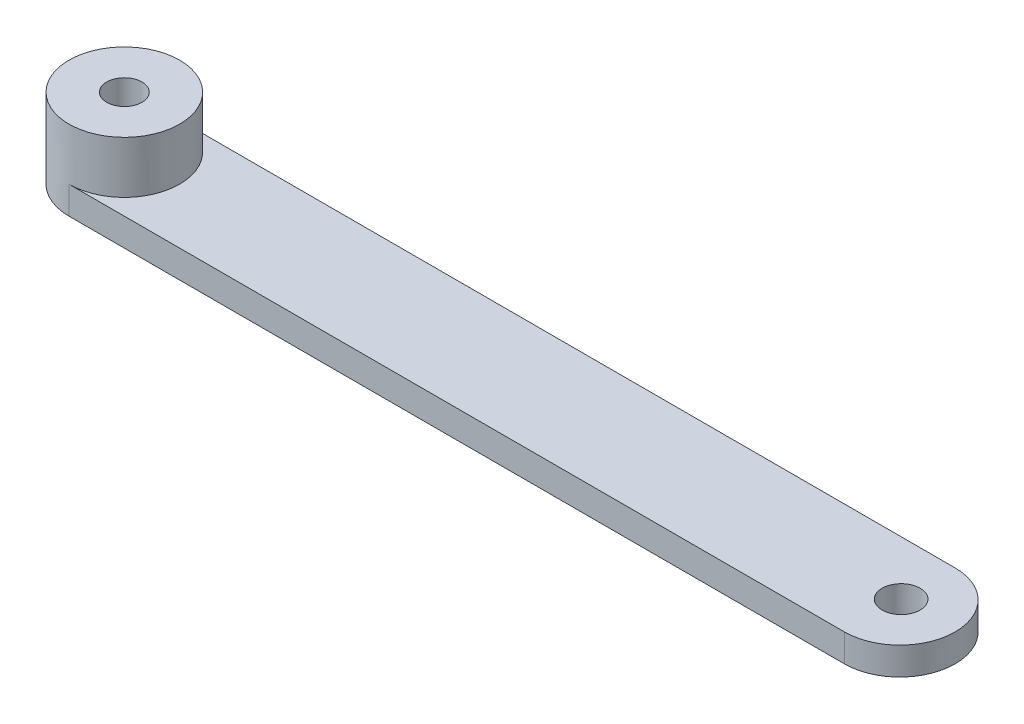
ISO-10303-21;
HEADER;
FILE_DESCRIPTION(('STEP AP214'),'2;1');
FILE_NAME('part.step','',(''),(''),'','','');
FILE_SCHEMA(('AUTOMOTIVE_DESIGN { 1 0 10303 214 1 1 1 1 }'));
ENDSEC;
DATA;
#1=APPLICATION_CONTEXT('core data for automotive mechanical design processes');
#2=APPLICATION_PROTOCOL_DEFINITION('international standard','automotive_design',2000,#1);
#3=PRODUCT_CONTEXT('',#1,'mechanical');
#4=PRODUCT('Part','Part','',(#3));
#5=PRODUCT_RELATED_PRODUCT_CATEGORY('part','',(#4));
#6=PRODUCT_DEFINITION_FORMATION('','',#4);
#7=PRODUCT_DEFINITION_CONTEXT('part definition',#1,'design');
#8=PRODUCT_DEFINITION('design','',#6,#7);
#9=PRODUCT_DEFINITION_SHAPE('','',#8);
#10=(LENGTH_UNIT() NAMED_UNIT(*) SI_UNIT(.MILLI.,.METRE.));
#11=(NAMED_UNIT(*) PLANE_ANGLE_UNIT() SI_UNIT($,.RADIAN.));
#12=(NAMED_UNIT(*) SI_UNIT($,.STERADIAN.) SOLID_ANGLE_UNIT());
#13=UNCERTAINTY_MEASURE_WITH_UNIT(LENGTH_MEASURE(1.E-05),#10,'distance_accuracy_value','');
#14=(GEOMETRIC_REPRESENTATION_CONTEXT(3) GLOBAL_UNCERTAINTY_ASSIGNED_CONTEXT((#13)) GLOBAL_UNIT_ASSIGNED_CONTEXT((#10,
#11,#12)) REPRESENTATION_CONTEXT('',''));
#15=CARTESIAN_POINT('',(0.,0.,0.));
#16=DIRECTION('',(0.,0.,1.));
#17=DIRECTION('',(1.,0.,0.));
#18=AXIS2_PLACEMENT_3D('',#15,#16,#17);
#19=CARTESIAN_POINT('',(-23.1719298245614,3.175,0.724122807017544));
#20=DIRECTION('',(0.,-1.,0.));
#21=DIRECTION('',(0.,0.,-1.));
#22=AXIS2_PLACEMENT_3D('',#19,#20,#21);
#23=CYLINDRICAL_SURFACE('',#22,6.35);
#24=CARTESIAN_POINT('',(-23.1719298245614,0.,0.724122807017544));
#25=DIRECTION('',(0.,1.,0.));
#26=DIRECTION('',(0.,0.,1.));
#27=AXIS2_PLACEMENT_3D('',#24,#25,#26);
#28=CIRCLE('',#27,6.35);
#29=CARTESIAN_POINT('',(-23.1719298245614,0.,-5.62587719298245));
#30=VERTEX_POINT('',#29);
#31=CARTESIAN_POINT('',(-23.1719298245614,0.,7.07412280701754));
#32=VERTEX_POINT('',#31);
#33=EDGE_CURVE('E101',#30,#32,#28,.T.);
#34=ORIENTED_EDGE('',*,*,#33,.T.);
#35=DIRECTION('',(0.,-1.,0.));
#36=VECTOR('',#35,1.);
#37=CARTESIAN_POINT('',(-23.1719298245614,3.175,7.07412280701754));
#38=LINE('',#37,#36);
#39=CARTESIAN_POINT('',(-23.1719298245614,3.175,7.07412280701754));
#40=VERTEX_POINT('',#39);
#41=EDGE_CURVE('E11',#40,#32,#38,.T.);
#42=ORIENTED_EDGE('',*,*,#41,.F.);
#43=CARTESIAN_POINT('',(-23.1719298245614,3.175,0.724122807017545));
#44=DIRECTION('',(0.,1.,0.));
#45=DIRECTION('',(0.,0.,1.));
#46=AXIS2_PLACEMENT_3D('',#43,#44,#45);
#47=CIRCLE('',#46,6.35);
#48=CARTESIAN_POINT('',(-23.1719298245614,3.175,-5.62587719298245));
#49=VERTEX_POINT('',#48);
#50=EDGE_CURVE('E99',#40,#49,#47,.T.);
#51=ORIENTED_EDGE('',*,*,#50,.T.);
#52=DIRECTION('',(0.,-1.,0.));
#53=VECTOR('',#52,1.);
#54=CARTESIAN_POINT('',(-23.1719298245614,3.175,-5.62587719298245));
#55=LINE('',#54,#53);
#56=EDGE_CURVE('E138',#49,#30,#55,.T.);
#57=ORIENTED_EDGE('',*,*,#56,.T.);
#58=EDGE_LOOP('',(#34,#42,#51,#57));
#59=FACE_BOUND('',#58,.T.);
#60=CARTESIAN_POINT('',(-23.1719298245614,9.1375,0.724122807017545));
#61=DIRECTION('',(0.,1.,0.));
#62=DIRECTION('',(0.,0.,-1.));
#63=AXIS2_PLACEMENT_3D('',#60,#61,#62);
#64=CIRCLE('',#63,6.35);
#65=CARTESIAN_POINT('',(-23.1719298245614,9.1375,-5.62587719298245));
#66=VERTEX_POINT('',#65);
#67=EDGE_CURVE('E112',#66,#66,#64,.T.);
#68=ORIENTED_EDGE('',*,*,#67,.F.);
#69=EDGE_LOOP('',(#68));
#70=FACE_BOUND('',#69,.T.);
#71=ADVANCED_FACE('F44',(#59,#70),#23,.T.);
#72=CARTESIAN_POINT('',(-23.1719298245614,3.175,7.07412280701754));
#73=DIRECTION('',(0.,0.,-1.));
#74=DIRECTION('',(-1.,0.,0.));
#75=AXIS2_PLACEMENT_3D('',#72,#73,#74);
#76=PLANE('',#75);
#77=DIRECTION('',(1.,0.,0.));
#78=VECTOR('',#77,1.);
#79=CARTESIAN_POINT('',(-23.1719298245614,0.,7.07412280701754));
#80=LINE('',#79,#78);
#81=CARTESIAN_POINT('',(65.7280701754386,0.,7.07412280701754));
#82=VERTEX_POINT('',#81);
#83=EDGE_CURVE('E141',#32,#82,#80,.T.);
#84=ORIENTED_EDGE('',*,*,#83,.T.);
#85=DIRECTION('',(0.,-1.,0.));
#86=VECTOR('',#85,1.);
#87=CARTESIAN_POINT('',(65.7280701754386,3.175,7.07412280701754));
#88=LINE('',#87,#86);
#89=CARTESIAN_POINT('',(65.7280701754386,3.175,7.07412280701754));
#90=VERTEX_POINT('',#89);
#91=EDGE_CURVE('E53',#90,#82,#88,.T.);
#92=ORIENTED_EDGE('',*,*,#91,.F.);
#93=DIRECTION('',(1.,0.,0.));
#94=VECTOR('',#93,1.);
#95=CARTESIAN_POINT('',(-23.1719298245614,3.175,7.07412280701754));
#96=LINE('',#95,#94);
#97=EDGE_CURVE('E91',#40,#90,#96,.T.);
#98=ORIENTED_EDGE('',*,*,#97,.F.);
#99=ORIENTED_EDGE('',*,*,#41,.T.);
#100=EDGE_LOOP('',(#84,#92,#98,#99));
#101=FACE_BOUND('',#100,.T.);
#102=ADVANCED_FACE('F103',(#101),#76,.F.);
#103=CARTESIAN_POINT('',(65.7280701754386,3.175,0.724122807017545));
#104=DIRECTION('',(0.,-1.,0.));
#105=DIRECTION('',(0.,0.,-1.));
#106=AXIS2_PLACEMENT_3D('',#103,#104,#105);
#107=CYLINDRICAL_SURFACE('',#106,6.35);
#108=CARTESIAN_POINT('',(65.7280701754386,0.,0.724122807017545));
#109=DIRECTION('',(0.,1.,0.));
#110=DIRECTION('',(0.,0.,-1.));
#111=AXIS2_PLACEMENT_3D('',#108,#109,#110);
#112=CIRCLE('',#111,6.35);
#113=CARTESIAN_POINT('',(65.7280701754386,0.,-5.62587719298245));
#114=VERTEX_POINT('',#113);
#115=EDGE_CURVE('E144',#82,#114,#112,.T.);
#116=ORIENTED_EDGE('',*,*,#115,.T.);
#117=DIRECTION('',(0.,-1.,0.));
#118=VECTOR('',#117,1.);
#119=CARTESIAN_POINT('',(65.7280701754386,3.175,-5.62587719298245));
#120=LINE('',#119,#118);
#121=CARTESIAN_POINT('',(65.7280701754386,3.175,-5.62587719298245));
#122=VERTEX_POINT('',#121);
#123=EDGE_CURVE('E151',#122,#114,#120,.T.);
#124=ORIENTED_EDGE('',*,*,#123,.F.);
#125=CARTESIAN_POINT('',(65.7280701754386,3.175,0.724122807017545));
#126=DIRECTION('',(0.,1.,0.));
#127=DIRECTION('',(0.,0.,-1.));
#128=AXIS2_PLACEMENT_3D('',#125,#126,#127);
#129=CIRCLE('',#128,6.35);
#130=EDGE_CURVE('E107',#90,#122,#129,.T.);
#131=ORIENTED_EDGE('',*,*,#130,.F.);
#132=ORIENTED_EDGE('',*,*,#91,.T.);
#133=EDGE_LOOP('',(#116,#124,#131,#132));
#134=FACE_BOUND('',#133,.T.);
#135=ADVANCED_FACE('F188',(#134),#107,.T.);
#136=CARTESIAN_POINT('',(-23.1719298245614,3.175,-5.62587719298245));
#137=DIRECTION('',(0.,0.,1.));
#138=DIRECTION('',(1.,0.,0.));
#139=AXIS2_PLACEMENT_3D('',#136,#137,#138);
#140=PLANE('',#139);
#141=DIRECTION('',(-1.,0.,0.));
#142=VECTOR('',#141,1.);
#143=CARTESIAN_POINT('',(-23.1719298245614,0.,-5.62587719298245));
#144=LINE('',#143,#142);
#145=EDGE_CURVE('E87',#114,#30,#144,.T.);
#146=ORIENTED_EDGE('',*,*,#145,.T.);
#147=ORIENTED_EDGE('',*,*,#56,.F.);
#148=DIRECTION('',(-1.,0.,0.));
#149=VECTOR('',#148,1.);
#150=CARTESIAN_POINT('',(-23.1719298245614,3.175,-5.62587719298245));
#151=LINE('',#150,#149);
#152=EDGE_CURVE('E67',#122,#49,#151,.T.);
#153=ORIENTED_EDGE('',*,*,#152,.F.);
#154=ORIENTED_EDGE('',*,*,#123,.T.);
#155=EDGE_LOOP('',(#146,#147,#153,#154));
#156=FACE_BOUND('',#155,.T.);
#157=ADVANCED_FACE('F192',(#156),#140,.F.);
#158=CARTESIAN_POINT('',(-23.1719298245614,3.175,0.724122807017544));
#159=DIRECTION('',(0.,1.,0.));
#160=DIRECTION('',(0.,0.,1.));
#161=AXIS2_PLACEMENT_3D('',#158,#159,#160);
#162=PLANE('',#161);
#163=ORIENTED_EDGE('',*,*,#50,.F.);
#164=ORIENTED_EDGE('',*,*,#97,.T.);
#165=ORIENTED_EDGE('',*,*,#130,.T.);
#166=ORIENTED_EDGE('',*,*,#152,.T.);
#167=EDGE_LOOP('',(#163,#164,#165,#166));
#168=FACE_BOUND('',#167,.T.);
#169=CARTESIAN_POINT('',(65.7280701754386,3.175,0.570780948600378));
#170=DIRECTION('',(0.,1.,0.));
#171=DIRECTION('',(0.,0.,1.));
#172=AXIS2_PLACEMENT_3D('',#169,#170,#171);
#173=CIRCLE('',#172,2.17500000000001);
#174=CARTESIAN_POINT('',(65.7280701754386,3.175,2.74578094860039));
#175=VERTEX_POINT('',#174);
#176=EDGE_CURVE('E120',#175,#175,#173,.T.);
#177=ORIENTED_EDGE('',*,*,#176,.F.);
#178=EDGE_LOOP('',(#177));
#179=FACE_BOUND('',#178,.T.);
#180=ADVANCED_FACE('F109',(#168,#179),#162,.T.);
#181=CARTESIAN_POINT('',(-23.1719298245614,0.,0.724122807017544));
#182=DIRECTION('',(0.,1.,0.));
#183=DIRECTION('',(0.,0.,1.));
#184=AXIS2_PLACEMENT_3D('',#181,#182,#183);
#185=PLANE('',#184);
#186=CARTESIAN_POINT('',(-23.1719298245614,0.,0.570780948600378));
#187=DIRECTION('',(0.,1.,0.));
#188=DIRECTION('',(0.,0.,1.));
#189=AXIS2_PLACEMENT_3D('',#186,#187,#188);
#190=CIRCLE('',#189,2.175);
#191=CARTESIAN_POINT('',(-23.1719298245614,0.,2.74578094860038));
#192=VERTEX_POINT('',#191);
#193=EDGE_CURVE('E47',#192,#192,#190,.T.);
#194=ORIENTED_EDGE('',*,*,#193,.T.);
#195=EDGE_LOOP('',(#194));
#196=FACE_BOUND('',#195,.T.);
#197=CARTESIAN_POINT('',(65.7280701754386,0.,0.570780948600378));
#198=DIRECTION('',(0.,1.,0.));
#199=DIRECTION('',(0.,0.,1.));
#200=AXIS2_PLACEMENT_3D('',#197,#198,#199);
#201=CIRCLE('',#200,2.17500000000001);
#202=CARTESIAN_POINT('',(65.7280701754386,0.,2.74578094860039));
#203=VERTEX_POINT('',#202);
#204=EDGE_CURVE('E130',#203,#203,#201,.T.);
#205=ORIENTED_EDGE('',*,*,#204,.T.);
#206=EDGE_LOOP('',(#205));
#207=FACE_BOUND('',#206,.T.);
#208=ORIENTED_EDGE('',*,*,#33,.F.);
#209=ORIENTED_EDGE('',*,*,#145,.F.);
#210=ORIENTED_EDGE('',*,*,#115,.F.);
#211=ORIENTED_EDGE('',*,*,#83,.F.);
#212=EDGE_LOOP('',(#208,#209,#210,#211));
#213=FACE_BOUND('',#212,.T.);
#214=ADVANCED_FACE('F167',(#196,#207,#213),#185,.F.);
#215=CARTESIAN_POINT('',(65.7280701754386,-9.525,0.570780948600378));
#216=DIRECTION('',(0.,1.,0.));
#217=DIRECTION('',(0.,0.,1.));
#218=AXIS2_PLACEMENT_3D('',#215,#216,#217);
#219=CYLINDRICAL_SURFACE('',#218,2.17500000000001);
#220=ORIENTED_EDGE('',*,*,#176,.T.);
#221=EDGE_LOOP('',(#220));
#222=FACE_BOUND('',#221,.T.);
#223=ORIENTED_EDGE('',*,*,#204,.F.);
#224=EDGE_LOOP('',(#223));
#225=FACE_BOUND('',#224,.T.);
#226=ADVANCED_FACE('F172',(#222,#225),#219,.F.);
#227=CARTESIAN_POINT('',(-23.1719298245614,-9.525,0.570780948600378));
#228=DIRECTION('',(0.,1.,0.));
#229=DIRECTION('',(0.,0.,1.));
#230=AXIS2_PLACEMENT_3D('',#227,#228,#229);
#231=CYLINDRICAL_SURFACE('',#230,2.175);
#232=CARTESIAN_POINT('',(-23.1719298245614,3.175,0.570780948600378));
#233=DIRECTION('',(0.,1.,0.));
#234=DIRECTION('',(0.,0.,1.));
#235=AXIS2_PLACEMENT_3D('',#232,#233,#234);
#236=CIRCLE('',#235,2.175);
#237=CARTESIAN_POINT('',(-23.1719298245614,3.175,2.74578094860038));
#238=VERTEX_POINT('',#237);
#239=EDGE_CURVE('E126',#238,#238,#236,.T.);
#240=ORIENTED_EDGE('',*,*,#239,.T.);
#241=EDGE_LOOP('',(#240));
#242=FACE_BOUND('',#241,.T.);
#243=ORIENTED_EDGE('',*,*,#193,.F.);
#244=EDGE_LOOP('',(#243));
#245=FACE_BOUND('',#244,.T.);
#246=ADVANCED_FACE('F169',(#242,#245),#231,.F.);
#247=CARTESIAN_POINT('',(-23.1719298245614,3.175,0.724122807017545));
#248=DIRECTION('',(0.,-1.,0.));
#249=DIRECTION('',(0.,0.,-1.));
#250=AXIS2_PLACEMENT_3D('',#247,#248,#249);
#251=PLANE('',#250);
#252=CARTESIAN_POINT('',(-23.1719298245614,3.175,0.724122807017545));
#253=DIRECTION('',(0.,1.,0.));
#254=DIRECTION('',(0.,0.,1.));
#255=AXIS2_PLACEMENT_3D('',#252,#253,#254);
#256=CIRCLE('',#255,2.02165814158283);
#257=EDGE_CURVE('E59',#238,#238,#256,.T.);
#258=ORIENTED_EDGE('',*,*,#257,.T.);
#259=ORIENTED_EDGE('',*,*,#239,.F.);
#260=EDGE_LOOP('',(#258,#259));
#261=FACE_BOUND('',#260,.T.);
#262=ADVANCED_FACE('F171',(#261),#251,.T.);
#263=CARTESIAN_POINT('',(-23.1719298245614,9.1375,0.724122807017545));
#264=DIRECTION('',(0.,-1.,0.));
#265=DIRECTION('',(0.,0.,-1.));
#266=AXIS2_PLACEMENT_3D('',#263,#264,#265);
#267=PLANE('',#266);
#268=ORIENTED_EDGE('',*,*,#67,.T.);
#269=EDGE_LOOP('',(#268));
#270=FACE_BOUND('',#269,.T.);
#271=CARTESIAN_POINT('',(-23.1719298245614,9.1375,0.724122807017545));
#272=DIRECTION('',(0.,1.,0.));
#273=DIRECTION('',(0.,0.,1.));
#274=AXIS2_PLACEMENT_3D('',#271,#272,#273);
#275=CIRCLE('',#274,2.02165814158283);
#276=CARTESIAN_POINT('',(-23.1719298245614,9.1375,2.74578094860038));
#277=VERTEX_POINT('',#276);
#278=EDGE_CURVE('E113',#277,#277,#275,.T.);
#279=ORIENTED_EDGE('',*,*,#278,.F.);
#280=EDGE_LOOP('',(#279));
#281=FACE_BOUND('',#280,.T.);
#282=ADVANCED_FACE('F179',(#270,#281),#267,.F.);
#283=CARTESIAN_POINT('',(-23.1719298245614,9.1375,0.724122807017545));
#284=DIRECTION('',(0.,-1.,0.));
#285=DIRECTION('',(0.,0.,-1.));
#286=AXIS2_PLACEMENT_3D('',#283,#284,#285);
#287=CYLINDRICAL_SURFACE('',#286,2.02165814158283);
#288=ORIENTED_EDGE('',*,*,#278,.T.);
#289=EDGE_LOOP('',(#288));
#290=FACE_BOUND('',#289,.T.);
#291=ORIENTED_EDGE('',*,*,#257,.F.);
#292=EDGE_LOOP('',(#291));
#293=FACE_BOUND('',#292,.T.);
#294=ADVANCED_FACE('F260',(#290,#293),#287,.F.);
#295=CLOSED_SHELL('',(#71,#102,#135,#157,#180,#214,#226,#246,#262,#282,#294));
#296=MANIFOLD_SOLID_BREP('B2',#295);
#297=ADVANCED_BREP_SHAPE_REPRESENTATION('',(#18,#296),#14);
#298=SHAPE_DEFINITION_REPRESENTATION(#9,#297);
ENDSEC;
END-ISO-10303-21;
